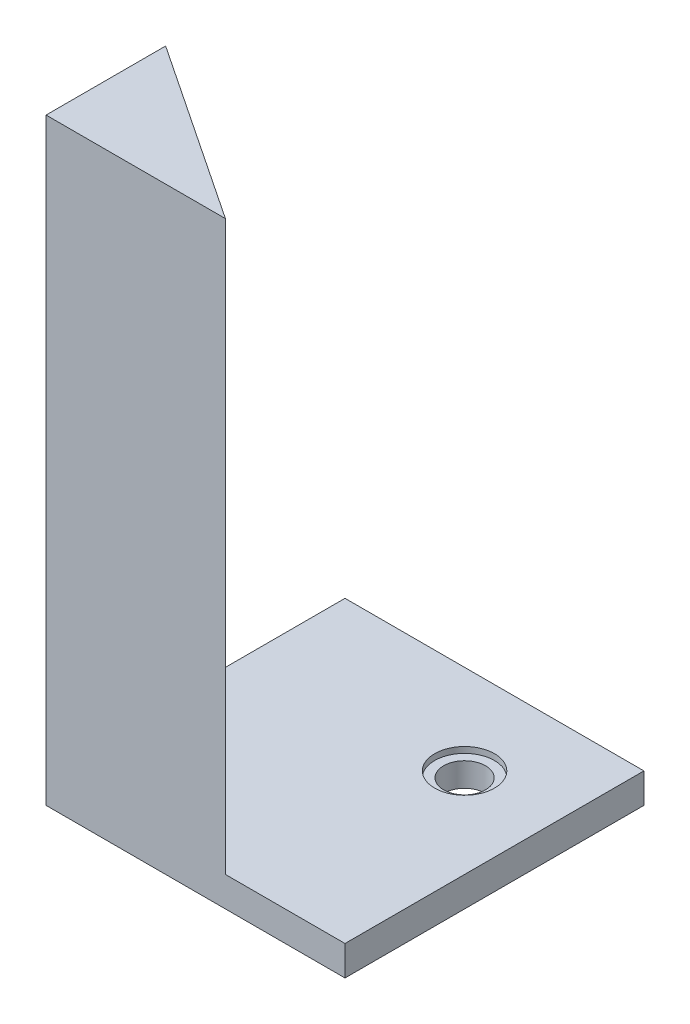
ISO-10303-21;
HEADER;
FILE_DESCRIPTION(('STEP AP214'),'2;1');
FILE_NAME('part.step','',(''),(''),'','','');
FILE_SCHEMA(('AUTOMOTIVE_DESIGN { 1 0 10303 214 1 1 1 1 }'));
ENDSEC;
DATA;
#1=APPLICATION_CONTEXT('core data for automotive mechanical design processes');
#2=APPLICATION_PROTOCOL_DEFINITION('international standard','automotive_design',2000,#1);
#3=PRODUCT_CONTEXT('',#1,'mechanical');
#4=PRODUCT('Part','Part','',(#3));
#5=PRODUCT_RELATED_PRODUCT_CATEGORY('part','',(#4));
#6=PRODUCT_DEFINITION_FORMATION('','',#4);
#7=PRODUCT_DEFINITION_CONTEXT('part definition',#1,'design');
#8=PRODUCT_DEFINITION('design','',#6,#7);
#9=PRODUCT_DEFINITION_SHAPE('','',#8);
#10=(LENGTH_UNIT() NAMED_UNIT(*) SI_UNIT(.MILLI.,.METRE.));
#11=(NAMED_UNIT(*) PLANE_ANGLE_UNIT() SI_UNIT($,.RADIAN.));
#12=(NAMED_UNIT(*) SI_UNIT($,.STERADIAN.) SOLID_ANGLE_UNIT());
#13=UNCERTAINTY_MEASURE_WITH_UNIT(LENGTH_MEASURE(1.E-05),#10,'distance_accuracy_value','');
#14=(GEOMETRIC_REPRESENTATION_CONTEXT(3) GLOBAL_UNCERTAINTY_ASSIGNED_CONTEXT((#13)) GLOBAL_UNIT_ASSIGNED_CONTEXT((#10,
#11,#12)) REPRESENTATION_CONTEXT('',''));
#15=CARTESIAN_POINT('',(0.,0.,0.));
#16=DIRECTION('',(0.,0.,1.));
#17=DIRECTION('',(1.,0.,0.));
#18=AXIS2_PLACEMENT_3D('',#15,#16,#17);
#19=CARTESIAN_POINT('',(35.,0.,-35.));
#20=DIRECTION('',(0.,1.,0.));
#21=DIRECTION('',(0.,0.,1.));
#22=AXIS2_PLACEMENT_3D('',#19,#20,#21);
#23=CYLINDRICAL_SURFACE('',#22,3.5);
#24=CARTESIAN_POINT('',(35.,0.,-35.));
#25=DIRECTION('',(0.,1.,0.));
#26=DIRECTION('',(0.,0.,1.));
#27=AXIS2_PLACEMENT_3D('',#24,#25,#26);
#28=CIRCLE('',#27,3.5);
#29=CARTESIAN_POINT('',(35.,0.,-31.5));
#30=VERTEX_POINT('',#29);
#31=EDGE_CURVE('E129',#30,#30,#28,.T.);
#32=ORIENTED_EDGE('',*,*,#31,.F.);
#33=EDGE_LOOP('',(#32));
#34=FACE_BOUND('',#33,.T.);
#35=CARTESIAN_POINT('',(35.,4.,-35.));
#36=DIRECTION('',(0.,1.,0.));
#37=DIRECTION('',(0.,0.,1.));
#38=AXIS2_PLACEMENT_3D('',#35,#36,#37);
#39=CIRCLE('',#38,3.5);
#40=CARTESIAN_POINT('',(35.,4.,-31.5));
#41=VERTEX_POINT('',#40);
#42=EDGE_CURVE('E43',#41,#41,#39,.F.);
#43=ORIENTED_EDGE('',*,*,#42,.F.);
#44=EDGE_LOOP('',(#43));
#45=FACE_BOUND('',#44,.T.);
#46=ADVANCED_FACE('F39',(#34,#45),#23,.F.);
#47=CARTESIAN_POINT('',(0.,100.,-20.));
#48=DIRECTION('',(-0.554700196225229,0.,0.832050294337843));
#49=DIRECTION('',(0.832050294337844,0.,0.554700196225229));
#50=AXIS2_PLACEMENT_3D('',#47,#48,#49);
#51=PLANE('',#50);
#52=DIRECTION('',(0.832050294337844,0.,0.554700196225229));
#53=VECTOR('',#52,1.);
#54=CARTESIAN_POINT('',(0.,5.,-20.));
#55=LINE('',#54,#53);
#56=CARTESIAN_POINT('',(0.,5.,-20.));
#57=VERTEX_POINT('',#56);
#58=CARTESIAN_POINT('',(30.,5.,0.));
#59=VERTEX_POINT('',#58);
#60=EDGE_CURVE('E58',#57,#59,#55,.T.);
#61=ORIENTED_EDGE('',*,*,#60,.F.);
#62=DIRECTION('',(0.,-1.,0.));
#63=VECTOR('',#62,1.);
#64=CARTESIAN_POINT('',(0.,100.,-20.));
#65=LINE('',#64,#63);
#66=CARTESIAN_POINT('',(0.,100.,-20.));
#67=VERTEX_POINT('',#66);
#68=EDGE_CURVE('E49',#67,#57,#65,.T.);
#69=ORIENTED_EDGE('',*,*,#68,.F.);
#70=DIRECTION('',(-0.832050294337844,0.,-0.554700196225229));
#71=VECTOR('',#70,1.);
#72=CARTESIAN_POINT('',(0.,100.,-20.));
#73=LINE('',#72,#71);
#74=CARTESIAN_POINT('',(30.,100.,0.));
#75=VERTEX_POINT('',#74);
#76=EDGE_CURVE('E146',#75,#67,#73,.T.);
#77=ORIENTED_EDGE('',*,*,#76,.F.);
#78=DIRECTION('',(0.,-1.,0.));
#79=VECTOR('',#78,1.);
#80=CARTESIAN_POINT('',(30.,100.,0.));
#81=LINE('',#80,#79);
#82=EDGE_CURVE('E11',#75,#59,#81,.T.);
#83=ORIENTED_EDGE('',*,*,#82,.T.);
#84=EDGE_LOOP('',(#61,#69,#77,#83));
#85=FACE_BOUND('',#84,.T.);
#86=ADVANCED_FACE('F181',(#85),#51,.F.);
#87=CARTESIAN_POINT('',(0.,100.,0.));
#88=DIRECTION('',(0.,0.,-1.));
#89=DIRECTION('',(-1.,0.,0.));
#90=AXIS2_PLACEMENT_3D('',#87,#88,#89);
#91=PLANE('',#90);
#92=DIRECTION('',(1.,0.,0.));
#93=VECTOR('',#92,1.);
#94=CARTESIAN_POINT('',(0.,0.,0.));
#95=LINE('',#94,#93);
#96=CARTESIAN_POINT('',(0.,0.,0.));
#97=VERTEX_POINT('',#96);
#98=CARTESIAN_POINT('',(50.,0.,0.));
#99=VERTEX_POINT('',#98);
#100=EDGE_CURVE('E141',#97,#99,#95,.T.);
#101=ORIENTED_EDGE('',*,*,#100,.T.);
#102=DIRECTION('',(0.,-1.,0.));
#103=VECTOR('',#102,1.);
#104=CARTESIAN_POINT('',(50.,5.,0.));
#105=LINE('',#104,#103);
#106=CARTESIAN_POINT('',(50.,5.,0.));
#107=VERTEX_POINT('',#106);
#108=EDGE_CURVE('E133',#107,#99,#105,.T.);
#109=ORIENTED_EDGE('',*,*,#108,.F.);
#110=DIRECTION('',(-1.,0.,0.));
#111=VECTOR('',#110,1.);
#112=CARTESIAN_POINT('',(0.,5.,0.));
#113=LINE('',#112,#111);
#114=EDGE_CURVE('E111',#107,#59,#113,.T.);
#115=ORIENTED_EDGE('',*,*,#114,.T.);
#116=ORIENTED_EDGE('',*,*,#82,.F.);
#117=DIRECTION('',(1.,0.,0.));
#118=VECTOR('',#117,1.);
#119=CARTESIAN_POINT('',(0.,100.,0.));
#120=LINE('',#119,#118);
#121=CARTESIAN_POINT('',(0.,100.,0.));
#122=VERTEX_POINT('',#121);
#123=EDGE_CURVE('E142',#122,#75,#120,.T.);
#124=ORIENTED_EDGE('',*,*,#123,.F.);
#125=DIRECTION('',(0.,-1.,0.));
#126=VECTOR('',#125,1.);
#127=CARTESIAN_POINT('',(0.,100.,0.));
#128=LINE('',#127,#126);
#129=EDGE_CURVE('E153',#122,#97,#128,.T.);
#130=ORIENTED_EDGE('',*,*,#129,.T.);
#131=EDGE_LOOP('',(#101,#109,#115,#116,#124,#130));
#132=FACE_BOUND('',#131,.T.);
#133=ADVANCED_FACE('F41',(#132),#91,.F.);
#134=CARTESIAN_POINT('',(0.,100.,0.));
#135=DIRECTION('',(1.,0.,0.));
#136=DIRECTION('',(0.,0.,-1.));
#137=AXIS2_PLACEMENT_3D('',#134,#135,#136);
#138=PLANE('',#137);
#139=DIRECTION('',(0.,0.,1.));
#140=VECTOR('',#139,1.);
#141=CARTESIAN_POINT('',(0.,0.,0.));
#142=LINE('',#141,#140);
#143=CARTESIAN_POINT('',(0.,0.,-50.));
#144=VERTEX_POINT('',#143);
#145=EDGE_CURVE('E147',#144,#97,#142,.T.);
#146=ORIENTED_EDGE('',*,*,#145,.T.);
#147=ORIENTED_EDGE('',*,*,#129,.F.);
#148=DIRECTION('',(0.,0.,1.));
#149=VECTOR('',#148,1.);
#150=CARTESIAN_POINT('',(0.,100.,0.));
#151=LINE('',#150,#149);
#152=EDGE_CURVE('E150',#67,#122,#151,.T.);
#153=ORIENTED_EDGE('',*,*,#152,.F.);
#154=ORIENTED_EDGE('',*,*,#68,.T.);
#155=DIRECTION('',(0.,0.,-1.));
#156=VECTOR('',#155,1.);
#157=CARTESIAN_POINT('',(0.,5.,0.));
#158=LINE('',#157,#156);
#159=CARTESIAN_POINT('',(0.,5.,-50.));
#160=VERTEX_POINT('',#159);
#161=EDGE_CURVE('E91',#57,#160,#158,.T.);
#162=ORIENTED_EDGE('',*,*,#161,.T.);
#163=DIRECTION('',(0.,-1.,0.));
#164=VECTOR('',#163,1.);
#165=CARTESIAN_POINT('',(0.,5.,-50.));
#166=LINE('',#165,#164);
#167=EDGE_CURVE('E95',#160,#144,#166,.T.);
#168=ORIENTED_EDGE('',*,*,#167,.T.);
#169=EDGE_LOOP('',(#146,#147,#153,#154,#162,#168));
#170=FACE_BOUND('',#169,.T.);
#171=ADVANCED_FACE('F94',(#170),#138,.F.);
#172=CARTESIAN_POINT('',(0.,100.,0.));
#173=DIRECTION('',(0.,1.,0.));
#174=DIRECTION('',(0.,0.,1.));
#175=AXIS2_PLACEMENT_3D('',#172,#173,#174);
#176=PLANE('',#175);
#177=ORIENTED_EDGE('',*,*,#123,.T.);
#178=ORIENTED_EDGE('',*,*,#76,.T.);
#179=ORIENTED_EDGE('',*,*,#152,.T.);
#180=EDGE_LOOP('',(#177,#178,#179));
#181=FACE_BOUND('',#180,.T.);
#182=ADVANCED_FACE('F217',(#181),#176,.T.);
#183=CARTESIAN_POINT('',(0.,0.,0.));
#184=DIRECTION('',(0.,1.,0.));
#185=DIRECTION('',(0.,0.,1.));
#186=AXIS2_PLACEMENT_3D('',#183,#184,#185);
#187=PLANE('',#186);
#188=ORIENTED_EDGE('',*,*,#31,.T.);
#189=EDGE_LOOP('',(#188));
#190=FACE_BOUND('',#189,.T.);
#191=ORIENTED_EDGE('',*,*,#100,.F.);
#192=ORIENTED_EDGE('',*,*,#145,.F.);
#193=DIRECTION('',(1.,0.,0.));
#194=VECTOR('',#193,1.);
#195=CARTESIAN_POINT('',(0.,0.,-50.));
#196=LINE('',#195,#194);
#197=CARTESIAN_POINT('',(50.,0.,-50.));
#198=VERTEX_POINT('',#197);
#199=EDGE_CURVE('E108',#144,#198,#196,.T.);
#200=ORIENTED_EDGE('',*,*,#199,.T.);
#201=DIRECTION('',(0.,0.,1.));
#202=VECTOR('',#201,1.);
#203=CARTESIAN_POINT('',(50.,0.,0.));
#204=LINE('',#203,#202);
#205=EDGE_CURVE('E102',#198,#99,#204,.T.);
#206=ORIENTED_EDGE('',*,*,#205,.T.);
#207=EDGE_LOOP('',(#191,#192,#200,#206));
#208=FACE_BOUND('',#207,.T.);
#209=ADVANCED_FACE('F166',(#190,#208),#187,.F.);
#210=CARTESIAN_POINT('',(0.,5.,0.));
#211=DIRECTION('',(0.,-1.,0.));
#212=DIRECTION('',(0.,0.,-1.));
#213=AXIS2_PLACEMENT_3D('',#210,#211,#212);
#214=PLANE('',#213);
#215=CARTESIAN_POINT('',(35.,5.,-35.));
#216=DIRECTION('',(0.,1.,0.));
#217=DIRECTION('',(0.,0.,1.));
#218=AXIS2_PLACEMENT_3D('',#215,#216,#217);
#219=CIRCLE('',#218,5.);
#220=CARTESIAN_POINT('',(35.,5.,-30.));
#221=VERTEX_POINT('',#220);
#222=EDGE_CURVE('E208',#221,#221,#219,.T.);
#223=ORIENTED_EDGE('',*,*,#222,.F.);
#224=EDGE_LOOP('',(#223));
#225=FACE_BOUND('',#224,.T.);
#226=ORIENTED_EDGE('',*,*,#161,.F.);
#227=ORIENTED_EDGE('',*,*,#60,.T.);
#228=ORIENTED_EDGE('',*,*,#114,.F.);
#229=DIRECTION('',(0.,0.,1.));
#230=VECTOR('',#229,1.);
#231=CARTESIAN_POINT('',(50.,5.,0.));
#232=LINE('',#231,#230);
#233=CARTESIAN_POINT('',(50.,5.,-50.));
#234=VERTEX_POINT('',#233);
#235=EDGE_CURVE('E117',#234,#107,#232,.T.);
#236=ORIENTED_EDGE('',*,*,#235,.F.);
#237=DIRECTION('',(1.,0.,0.));
#238=VECTOR('',#237,1.);
#239=CARTESIAN_POINT('',(0.,5.,-50.));
#240=LINE('',#239,#238);
#241=EDGE_CURVE('E101',#160,#234,#240,.T.);
#242=ORIENTED_EDGE('',*,*,#241,.F.);
#243=EDGE_LOOP('',(#226,#227,#228,#236,#242));
#244=FACE_BOUND('',#243,.T.);
#245=ADVANCED_FACE('F114',(#225,#244),#214,.F.);
#246=CARTESIAN_POINT('',(50.,5.,0.));
#247=DIRECTION('',(1.,0.,0.));
#248=DIRECTION('',(0.,0.,-1.));
#249=AXIS2_PLACEMENT_3D('',#246,#247,#248);
#250=PLANE('',#249);
#251=ORIENTED_EDGE('',*,*,#205,.F.);
#252=DIRECTION('',(0.,-1.,0.));
#253=VECTOR('',#252,1.);
#254=CARTESIAN_POINT('',(50.,5.,-50.));
#255=LINE('',#254,#253);
#256=EDGE_CURVE('E110',#234,#198,#255,.T.);
#257=ORIENTED_EDGE('',*,*,#256,.F.);
#258=ORIENTED_EDGE('',*,*,#235,.T.);
#259=ORIENTED_EDGE('',*,*,#108,.T.);
#260=EDGE_LOOP('',(#251,#257,#258,#259));
#261=FACE_BOUND('',#260,.T.);
#262=ADVANCED_FACE('F169',(#261),#250,.T.);
#263=CARTESIAN_POINT('',(0.,5.,-50.));
#264=DIRECTION('',(0.,0.,-1.));
#265=DIRECTION('',(-1.,0.,0.));
#266=AXIS2_PLACEMENT_3D('',#263,#264,#265);
#267=PLANE('',#266);
#268=ORIENTED_EDGE('',*,*,#199,.F.);
#269=ORIENTED_EDGE('',*,*,#167,.F.);
#270=ORIENTED_EDGE('',*,*,#241,.T.);
#271=ORIENTED_EDGE('',*,*,#256,.T.);
#272=EDGE_LOOP('',(#268,#269,#270,#271));
#273=FACE_BOUND('',#272,.T.);
#274=ADVANCED_FACE('F106',(#273),#267,.T.);
#275=CARTESIAN_POINT('',(35.,4.,-35.));
#276=DIRECTION('',(0.,1.,0.));
#277=DIRECTION('',(0.,0.,1.));
#278=AXIS2_PLACEMENT_3D('',#275,#276,#277);
#279=PLANE('',#278);
#280=CARTESIAN_POINT('',(35.,4.,-35.));
#281=DIRECTION('',(0.,1.,0.));
#282=DIRECTION('',(0.,0.,1.));
#283=AXIS2_PLACEMENT_3D('',#280,#281,#282);
#284=CIRCLE('',#283,5.);
#285=CARTESIAN_POINT('',(35.,4.,-30.));
#286=VERTEX_POINT('',#285);
#287=EDGE_CURVE('E201',#286,#286,#284,.T.);
#288=ORIENTED_EDGE('',*,*,#287,.T.);
#289=EDGE_LOOP('',(#288));
#290=FACE_BOUND('',#289,.T.);
#291=ORIENTED_EDGE('',*,*,#42,.T.);
#292=EDGE_LOOP('',(#291));
#293=FACE_BOUND('',#292,.T.);
#294=ADVANCED_FACE('F176',(#290,#293),#279,.T.);
#295=CARTESIAN_POINT('',(35.,4.,-35.));
#296=DIRECTION('',(0.,1.,0.));
#297=DIRECTION('',(0.,0.,1.));
#298=AXIS2_PLACEMENT_3D('',#295,#296,#297);
#299=CYLINDRICAL_SURFACE('',#298,5.);
#300=ORIENTED_EDGE('',*,*,#287,.F.);
#301=EDGE_LOOP('',(#300));
#302=FACE_BOUND('',#301,.T.);
#303=ORIENTED_EDGE('',*,*,#222,.T.);
#304=EDGE_LOOP('',(#303));
#305=FACE_BOUND('',#304,.T.);
#306=ADVANCED_FACE('F190',(#302,#305),#299,.F.);
#307=CLOSED_SHELL('',(#46,#86,#133,#171,#182,#209,#245,#262,#274,#294,#306));
#308=MANIFOLD_SOLID_BREP('B2',#307);
#309=ADVANCED_BREP_SHAPE_REPRESENTATION('',(#18,#308),#14);
#310=SHAPE_DEFINITION_REPRESENTATION(#9,#309);
ENDSEC;
END-ISO-10303-21;
